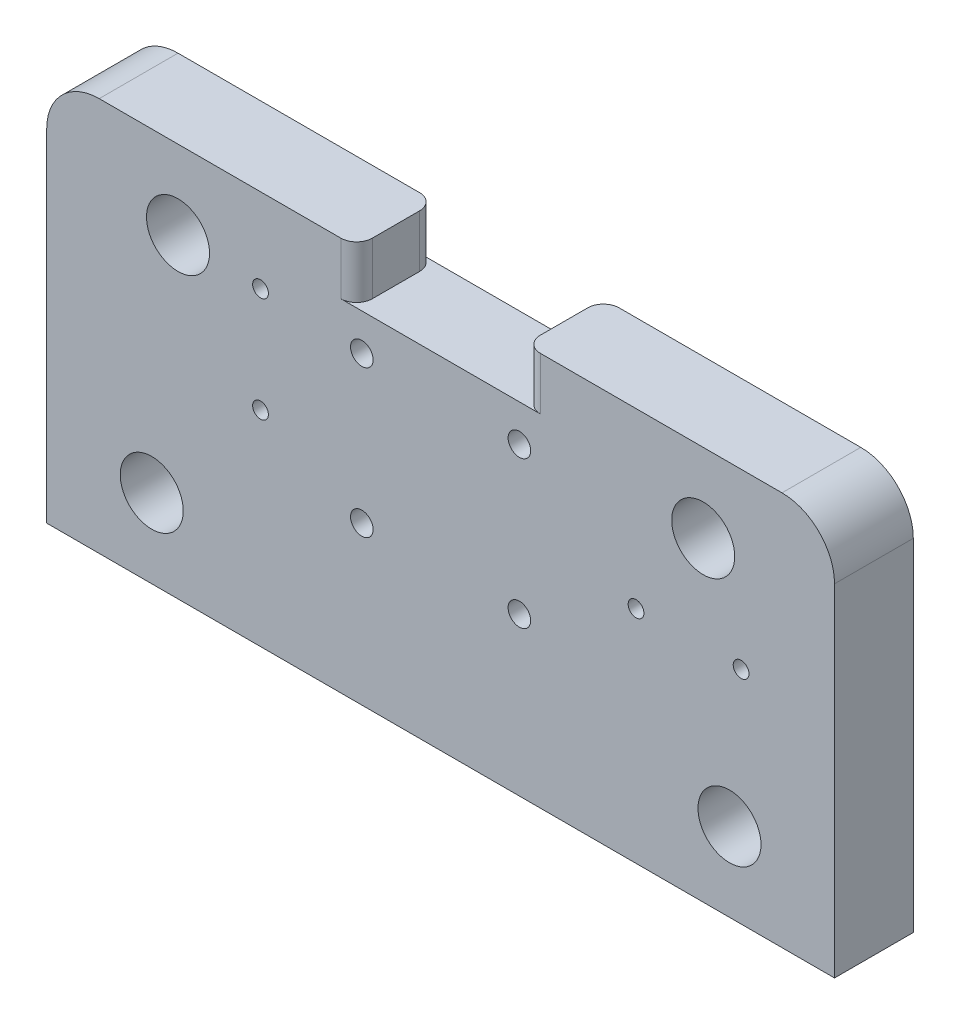
ISO-10303-21;
HEADER;
FILE_DESCRIPTION(('STEP AP214'),'2;1');
FILE_NAME('part.step','',(''),(''),'','','');
FILE_SCHEMA(('AUTOMOTIVE_DESIGN { 1 0 10303 214 1 1 1 1 }'));
ENDSEC;
DATA;
#1=APPLICATION_CONTEXT('core data for automotive mechanical design processes');
#2=APPLICATION_PROTOCOL_DEFINITION('international standard','automotive_design',2000,#1);
#3=PRODUCT_CONTEXT('',#1,'mechanical');
#4=PRODUCT('Part','Part','',(#3));
#5=PRODUCT_RELATED_PRODUCT_CATEGORY('part','',(#4));
#6=PRODUCT_DEFINITION_FORMATION('','',#4);
#7=PRODUCT_DEFINITION_CONTEXT('part definition',#1,'design');
#8=PRODUCT_DEFINITION('design','',#6,#7);
#9=PRODUCT_DEFINITION_SHAPE('','',#8);
#10=(LENGTH_UNIT() NAMED_UNIT(*) SI_UNIT(.MILLI.,.METRE.));
#11=(NAMED_UNIT(*) PLANE_ANGLE_UNIT() SI_UNIT($,.RADIAN.));
#12=(NAMED_UNIT(*) SI_UNIT($,.STERADIAN.) SOLID_ANGLE_UNIT());
#13=UNCERTAINTY_MEASURE_WITH_UNIT(LENGTH_MEASURE(1.E-05),#10,'distance_accuracy_value','');
#14=(GEOMETRIC_REPRESENTATION_CONTEXT(3) GLOBAL_UNCERTAINTY_ASSIGNED_CONTEXT((#13)) GLOBAL_UNIT_ASSIGNED_CONTEXT((#10,
#11,#12)) REPRESENTATION_CONTEXT('',''));
#15=CARTESIAN_POINT('',(0.,0.,0.));
#16=DIRECTION('',(0.,0.,1.));
#17=DIRECTION('',(1.,0.,0.));
#18=AXIS2_PLACEMENT_3D('',#15,#16,#17);
#19=CARTESIAN_POINT('',(-65.,27.5,15.));
#20=DIRECTION('',(0.,0.,-1.));
#21=DIRECTION('',(-1.,0.,0.));
#22=AXIS2_PLACEMENT_3D('',#19,#20,#21);
#23=PLANE('',#22);
#24=CARTESIAN_POINT('',(57.21,4.5,15.));
#25=DIRECTION('',(0.,0.,1.));
#26=DIRECTION('',(1.,0.,0.));
#27=AXIS2_PLACEMENT_3D('',#24,#25,#26);
#28=CIRCLE('',#27,1.5);
#29=CARTESIAN_POINT('',(58.71,4.5,15.));
#30=VERTEX_POINT('',#29);
#31=EDGE_CURVE('E745',#30,#30,#28,.T.);
#32=ORIENTED_EDGE('',*,*,#31,.F.);
#33=EDGE_LOOP('',(#32));
#34=FACE_BOUND('',#33,.T.);
#35=CARTESIAN_POINT('',(37.21,4.5,15.));
#36=DIRECTION('',(0.,0.,1.));
#37=DIRECTION('',(1.,0.,0.));
#38=AXIS2_PLACEMENT_3D('',#35,#36,#37);
#39=CIRCLE('',#38,1.5);
#40=CARTESIAN_POINT('',(38.71,4.5,15.));
#41=VERTEX_POINT('',#40);
#42=EDGE_CURVE('E741',#41,#41,#39,.T.);
#43=ORIENTED_EDGE('',*,*,#42,.F.);
#44=EDGE_LOOP('',(#43));
#45=FACE_BOUND('',#44,.T.);
#46=CARTESIAN_POINT('',(-34.29,1.50000000000002,15.));
#47=DIRECTION('',(0.,0.,1.));
#48=DIRECTION('',(1.,0.,0.));
#49=AXIS2_PLACEMENT_3D('',#46,#47,#48);
#50=CIRCLE('',#49,1.5);
#51=CARTESIAN_POINT('',(-32.79,1.50000000000002,15.));
#52=VERTEX_POINT('',#51);
#53=EDGE_CURVE('E730',#52,#52,#50,.T.);
#54=ORIENTED_EDGE('',*,*,#53,.F.);
#55=EDGE_LOOP('',(#54));
#56=FACE_BOUND('',#55,.T.);
#57=CARTESIAN_POINT('',(-34.29,21.5,15.));
#58=DIRECTION('',(0.,0.,1.));
#59=DIRECTION('',(1.,0.,0.));
#60=AXIS2_PLACEMENT_3D('',#57,#58,#59);
#61=CIRCLE('',#60,1.5);
#62=CARTESIAN_POINT('',(-32.79,21.5,15.));
#63=VERTEX_POINT('',#62);
#64=EDGE_CURVE('E721',#63,#63,#61,.T.);
#65=ORIENTED_EDGE('',*,*,#64,.F.);
#66=EDGE_LOOP('',(#65));
#67=FACE_BOUND('',#66,.T.);
#68=CARTESIAN_POINT('',(50.,22.5,15.));
#69=DIRECTION('',(0.,0.,1.));
#70=DIRECTION('',(1.,0.,0.));
#71=AXIS2_PLACEMENT_3D('',#68,#69,#70);
#72=CIRCLE('',#71,6.);
#73=CARTESIAN_POINT('',(56.,22.5,15.));
#74=VERTEX_POINT('',#73);
#75=EDGE_CURVE('E706',#74,#74,#72,.T.);
#76=ORIENTED_EDGE('',*,*,#75,.F.);
#77=EDGE_LOOP('',(#76));
#78=FACE_BOUND('',#77,.T.);
#79=CARTESIAN_POINT('',(-55.,-22.5,15.));
#80=DIRECTION('',(0.,0.,1.));
#81=DIRECTION('',(1.,0.,0.));
#82=AXIS2_PLACEMENT_3D('',#79,#80,#81);
#83=CIRCLE('',#82,5.99999999999999);
#84=CARTESIAN_POINT('',(-49.,-22.5,15.));
#85=VERTEX_POINT('',#84);
#86=EDGE_CURVE('E697',#85,#85,#83,.T.);
#87=ORIENTED_EDGE('',*,*,#86,.F.);
#88=EDGE_LOOP('',(#87));
#89=FACE_BOUND('',#88,.T.);
#90=CARTESIAN_POINT('',(55.,-22.5,15.));
#91=DIRECTION('',(0.,0.,1.));
#92=DIRECTION('',(1.,0.,0.));
#93=AXIS2_PLACEMENT_3D('',#90,#91,#92);
#94=CIRCLE('',#93,5.99999999999999);
#95=CARTESIAN_POINT('',(61.,-22.5,15.));
#96=VERTEX_POINT('',#95);
#97=EDGE_CURVE('E713',#96,#96,#94,.T.);
#98=ORIENTED_EDGE('',*,*,#97,.F.);
#99=EDGE_LOOP('',(#98));
#100=FACE_BOUND('',#99,.T.);
#101=CARTESIAN_POINT('',(-50.,22.5,15.));
#102=DIRECTION('',(0.,0.,1.));
#103=DIRECTION('',(1.,0.,0.));
#104=AXIS2_PLACEMENT_3D('',#101,#102,#103);
#105=CIRCLE('',#104,6.);
#106=CARTESIAN_POINT('',(-44.,22.5,15.));
#107=VERTEX_POINT('',#106);
#108=EDGE_CURVE('E689',#107,#107,#105,.T.);
#109=ORIENTED_EDGE('',*,*,#108,.F.);
#110=EDGE_LOOP('',(#109));
#111=FACE_BOUND('',#110,.T.);
#112=DIRECTION('',(1.,0.,0.));
#113=VECTOR('',#112,1.);
#114=CARTESIAN_POINT('',(16.,37.5,15.));
#115=LINE('',#114,#113);
#116=CARTESIAN_POINT('',(18.9999999999999,37.5,15.));
#117=VERTEX_POINT('',#116);
#118=CARTESIAN_POINT('',(65.,37.5,15.));
#119=VERTEX_POINT('',#118);
#120=EDGE_CURVE('E312',#117,#119,#115,.T.);
#121=ORIENTED_EDGE('',*,*,#120,.F.);
#122=DIRECTION('',(0.,-1.,0.));
#123=VECTOR('',#122,1.);
#124=CARTESIAN_POINT('',(18.9999999999999,27.5,15.));
#125=LINE('',#124,#123);
#126=CARTESIAN_POINT('',(18.9999999999999,27.5,15.));
#127=VERTEX_POINT('',#126);
#128=EDGE_CURVE('E402',#117,#127,#125,.T.);
#129=ORIENTED_EDGE('',*,*,#128,.T.);
#130=DIRECTION('',(1.,0.,0.));
#131=VECTOR('',#130,1.);
#132=CARTESIAN_POINT('',(-16.,27.5,15.));
#133=LINE('',#132,#131);
#134=CARTESIAN_POINT('',(-19.,27.5,15.));
#135=VERTEX_POINT('',#134);
#136=EDGE_CURVE('E295',#135,#127,#133,.T.);
#137=ORIENTED_EDGE('',*,*,#136,.F.);
#138=DIRECTION('',(0.,-1.,0.));
#139=VECTOR('',#138,1.);
#140=CARTESIAN_POINT('',(-19.,37.5,15.));
#141=LINE('',#140,#139);
#142=CARTESIAN_POINT('',(-19.,37.5,15.));
#143=VERTEX_POINT('',#142);
#144=EDGE_CURVE('E293',#135,#143,#141,.F.);
#145=ORIENTED_EDGE('',*,*,#144,.T.);
#146=DIRECTION('',(1.,0.,0.));
#147=VECTOR('',#146,1.);
#148=CARTESIAN_POINT('',(-65.,37.5,15.));
#149=LINE('',#148,#147);
#150=CARTESIAN_POINT('',(-65.,37.5,15.));
#151=VERTEX_POINT('',#150);
#152=EDGE_CURVE('E276',#151,#143,#149,.T.);
#153=ORIENTED_EDGE('',*,*,#152,.F.);
#154=CARTESIAN_POINT('',(-65.,27.5,15.));
#155=DIRECTION('',(0.,0.,-1.));
#156=DIRECTION('',(-1.,0.,0.));
#157=AXIS2_PLACEMENT_3D('',#154,#155,#156);
#158=CIRCLE('',#157,10.);
#159=CARTESIAN_POINT('',(-75.,27.5,15.));
#160=VERTEX_POINT('',#159);
#161=EDGE_CURVE('E292',#160,#151,#158,.T.);
#162=ORIENTED_EDGE('',*,*,#161,.F.);
#163=DIRECTION('',(0.,-1.,0.));
#164=VECTOR('',#163,1.);
#165=CARTESIAN_POINT('',(-75.,27.5,15.));
#166=LINE('',#165,#164);
#167=CARTESIAN_POINT('',(-75.,-37.5,15.));
#168=VERTEX_POINT('',#167);
#169=EDGE_CURVE('E286',#160,#168,#166,.T.);
#170=ORIENTED_EDGE('',*,*,#169,.T.);
#171=DIRECTION('',(1.,0.,0.));
#172=VECTOR('',#171,1.);
#173=CARTESIAN_POINT('',(-75.,-37.5,15.));
#174=LINE('',#173,#172);
#175=CARTESIAN_POINT('',(75.,-37.5,15.));
#176=VERTEX_POINT('',#175);
#177=EDGE_CURVE('E323',#168,#176,#174,.T.);
#178=ORIENTED_EDGE('',*,*,#177,.T.);
#179=DIRECTION('',(0.,-1.,0.));
#180=VECTOR('',#179,1.);
#181=CARTESIAN_POINT('',(75.,27.5,15.));
#182=LINE('',#181,#180);
#183=CARTESIAN_POINT('',(75.,27.5,15.));
#184=VERTEX_POINT('',#183);
#185=EDGE_CURVE('E319',#184,#176,#182,.T.);
#186=ORIENTED_EDGE('',*,*,#185,.F.);
#187=CARTESIAN_POINT('',(65.,27.5,15.));
#188=DIRECTION('',(0.,0.,1.));
#189=DIRECTION('',(1.,0.,0.));
#190=AXIS2_PLACEMENT_3D('',#187,#188,#189);
#191=CIRCLE('',#190,10.);
#192=EDGE_CURVE('E315',#184,#119,#191,.T.);
#193=ORIENTED_EDGE('',*,*,#192,.T.);
#194=EDGE_LOOP('',(#121,#129,#137,#145,#153,#162,#170,#178,#186,#193));
#195=FACE_BOUND('',#194,.T.);
#196=CARTESIAN_POINT('',(-15.,20.5,15.));
#197=DIRECTION('',(0.,0.,1.));
#198=DIRECTION('',(1.,0.,0.));
#199=AXIS2_PLACEMENT_3D('',#196,#197,#198);
#200=CIRCLE('',#199,2.15);
#201=CARTESIAN_POINT('',(-12.85,20.5,15.));
#202=VERTEX_POINT('',#201);
#203=EDGE_CURVE('E331',#202,#202,#200,.T.);
#204=ORIENTED_EDGE('',*,*,#203,.F.);
#205=EDGE_LOOP('',(#204));
#206=FACE_BOUND('',#205,.T.);
#207=CARTESIAN_POINT('',(15.,20.5,15.));
#208=DIRECTION('',(0.,0.,1.));
#209=DIRECTION('',(1.,0.,0.));
#210=AXIS2_PLACEMENT_3D('',#207,#208,#209);
#211=CIRCLE('',#210,2.15);
#212=CARTESIAN_POINT('',(17.15,20.5,15.));
#213=VERTEX_POINT('',#212);
#214=EDGE_CURVE('E650',#213,#213,#211,.T.);
#215=ORIENTED_EDGE('',*,*,#214,.F.);
#216=EDGE_LOOP('',(#215));
#217=FACE_BOUND('',#216,.T.);
#218=CARTESIAN_POINT('',(15.,-7.5,15.));
#219=DIRECTION('',(0.,0.,1.));
#220=DIRECTION('',(1.,0.,0.));
#221=AXIS2_PLACEMENT_3D('',#218,#219,#220);
#222=CIRCLE('',#221,2.15);
#223=CARTESIAN_POINT('',(17.15,-7.5,15.));
#224=VERTEX_POINT('',#223);
#225=EDGE_CURVE('E655',#224,#224,#222,.T.);
#226=ORIENTED_EDGE('',*,*,#225,.F.);
#227=EDGE_LOOP('',(#226));
#228=FACE_BOUND('',#227,.T.);
#229=CARTESIAN_POINT('',(-15.,-7.5,15.));
#230=DIRECTION('',(0.,0.,1.));
#231=DIRECTION('',(1.,0.,0.));
#232=AXIS2_PLACEMENT_3D('',#229,#230,#231);
#233=CIRCLE('',#232,2.15);
#234=CARTESIAN_POINT('',(-12.85,-7.5,15.));
#235=VERTEX_POINT('',#234);
#236=EDGE_CURVE('E678',#235,#235,#233,.T.);
#237=ORIENTED_EDGE('',*,*,#236,.F.);
#238=EDGE_LOOP('',(#237));
#239=FACE_BOUND('',#238,.T.);
#240=ADVANCED_FACE('F170',(#34,#45,#56,#67,#78,#89,#100,#111,#195,#206,#217,#228,#239),#23,.F.);
#241=CARTESIAN_POINT('',(-65.,27.5,0.));
#242=DIRECTION('',(0.,0.,-1.));
#243=DIRECTION('',(-1.,0.,0.));
#244=AXIS2_PLACEMENT_3D('',#241,#242,#243);
#245=PLANE('',#244);
#246=CARTESIAN_POINT('',(57.21,4.5,0.));
#247=DIRECTION('',(0.,0.,1.));
#248=DIRECTION('',(1.,0.,0.));
#249=AXIS2_PLACEMENT_3D('',#246,#247,#248);
#250=CIRCLE('',#249,1.5);
#251=CARTESIAN_POINT('',(58.71,4.5,0.));
#252=VERTEX_POINT('',#251);
#253=EDGE_CURVE('E726',#252,#252,#250,.T.);
#254=ORIENTED_EDGE('',*,*,#253,.T.);
#255=EDGE_LOOP('',(#254));
#256=FACE_BOUND('',#255,.T.);
#257=CARTESIAN_POINT('',(37.21,4.5,0.));
#258=DIRECTION('',(0.,0.,1.));
#259=DIRECTION('',(1.,0.,0.));
#260=AXIS2_PLACEMENT_3D('',#257,#258,#259);
#261=CIRCLE('',#260,1.5);
#262=CARTESIAN_POINT('',(38.71,4.5,0.));
#263=VERTEX_POINT('',#262);
#264=EDGE_CURVE('E737',#263,#263,#261,.T.);
#265=ORIENTED_EDGE('',*,*,#264,.T.);
#266=EDGE_LOOP('',(#265));
#267=FACE_BOUND('',#266,.T.);
#268=CARTESIAN_POINT('',(-34.29,1.50000000000002,0.));
#269=DIRECTION('',(0.,0.,1.));
#270=DIRECTION('',(1.,0.,0.));
#271=AXIS2_PLACEMENT_3D('',#268,#269,#270);
#272=CIRCLE('',#271,1.5);
#273=CARTESIAN_POINT('',(-32.79,1.50000000000002,0.));
#274=VERTEX_POINT('',#273);
#275=EDGE_CURVE('E717',#274,#274,#272,.T.);
#276=ORIENTED_EDGE('',*,*,#275,.T.);
#277=EDGE_LOOP('',(#276));
#278=FACE_BOUND('',#277,.T.);
#279=CARTESIAN_POINT('',(-34.29,21.5,0.));
#280=DIRECTION('',(0.,0.,1.));
#281=DIRECTION('',(1.,0.,0.));
#282=AXIS2_PLACEMENT_3D('',#279,#280,#281);
#283=CIRCLE('',#282,1.5);
#284=CARTESIAN_POINT('',(-32.79,21.5,0.));
#285=VERTEX_POINT('',#284);
#286=EDGE_CURVE('E725',#285,#285,#283,.T.);
#287=ORIENTED_EDGE('',*,*,#286,.T.);
#288=EDGE_LOOP('',(#287));
#289=FACE_BOUND('',#288,.T.);
#290=CARTESIAN_POINT('',(50.,22.5,0.));
#291=DIRECTION('',(0.,0.,1.));
#292=DIRECTION('',(1.,0.,0.));
#293=AXIS2_PLACEMENT_3D('',#290,#291,#292);
#294=CIRCLE('',#293,6.);
#295=CARTESIAN_POINT('',(56.,22.5,0.));
#296=VERTEX_POINT('',#295);
#297=EDGE_CURVE('E693',#296,#296,#294,.T.);
#298=ORIENTED_EDGE('',*,*,#297,.T.);
#299=EDGE_LOOP('',(#298));
#300=FACE_BOUND('',#299,.T.);
#301=CARTESIAN_POINT('',(-55.,-22.5,0.));
#302=DIRECTION('',(0.,0.,1.));
#303=DIRECTION('',(1.,0.,0.));
#304=AXIS2_PLACEMENT_3D('',#301,#302,#303);
#305=CIRCLE('',#304,5.99999999999999);
#306=CARTESIAN_POINT('',(-49.,-22.5,0.));
#307=VERTEX_POINT('',#306);
#308=EDGE_CURVE('E701',#307,#307,#305,.T.);
#309=ORIENTED_EDGE('',*,*,#308,.T.);
#310=EDGE_LOOP('',(#309));
#311=FACE_BOUND('',#310,.T.);
#312=CARTESIAN_POINT('',(55.,-22.5,0.));
#313=DIRECTION('',(0.,0.,1.));
#314=DIRECTION('',(1.,0.,0.));
#315=AXIS2_PLACEMENT_3D('',#312,#313,#314);
#316=CIRCLE('',#315,5.99999999999999);
#317=CARTESIAN_POINT('',(61.,-22.5,0.));
#318=VERTEX_POINT('',#317);
#319=EDGE_CURVE('E702',#318,#318,#316,.T.);
#320=ORIENTED_EDGE('',*,*,#319,.T.);
#321=EDGE_LOOP('',(#320));
#322=FACE_BOUND('',#321,.T.);
#323=CARTESIAN_POINT('',(-50.,22.5,0.));
#324=DIRECTION('',(0.,0.,1.));
#325=DIRECTION('',(1.,0.,0.));
#326=AXIS2_PLACEMENT_3D('',#323,#324,#325);
#327=CIRCLE('',#326,6.);
#328=CARTESIAN_POINT('',(-44.,22.5,0.));
#329=VERTEX_POINT('',#328);
#330=EDGE_CURVE('E686',#329,#329,#327,.T.);
#331=ORIENTED_EDGE('',*,*,#330,.T.);
#332=EDGE_LOOP('',(#331));
#333=FACE_BOUND('',#332,.T.);
#334=CARTESIAN_POINT('',(15.,-7.5,0.));
#335=DIRECTION('',(0.,0.,1.));
#336=DIRECTION('',(1.,0.,0.));
#337=AXIS2_PLACEMENT_3D('',#334,#335,#336);
#338=CIRCLE('',#337,2.15);
#339=CARTESIAN_POINT('',(17.15,-7.5,0.));
#340=VERTEX_POINT('',#339);
#341=EDGE_CURVE('E661',#340,#340,#338,.T.);
#342=ORIENTED_EDGE('',*,*,#341,.T.);
#343=EDGE_LOOP('',(#342));
#344=FACE_BOUND('',#343,.T.);
#345=CARTESIAN_POINT('',(-15.,20.5,0.));
#346=DIRECTION('',(0.,0.,1.));
#347=DIRECTION('',(1.,0.,0.));
#348=AXIS2_PLACEMENT_3D('',#345,#346,#347);
#349=CIRCLE('',#348,2.15);
#350=CARTESIAN_POINT('',(-12.85,20.5,0.));
#351=VERTEX_POINT('',#350);
#352=EDGE_CURVE('E307',#351,#351,#349,.T.);
#353=ORIENTED_EDGE('',*,*,#352,.T.);
#354=EDGE_LOOP('',(#353));
#355=FACE_BOUND('',#354,.T.);
#356=DIRECTION('',(1.,0.,0.));
#357=VECTOR('',#356,1.);
#358=CARTESIAN_POINT('',(-16.,27.5,0.));
#359=LINE('',#358,#357);
#360=CARTESIAN_POINT('',(-19.,27.5,0.));
#361=VERTEX_POINT('',#360);
#362=CARTESIAN_POINT('',(19.,27.5,0.));
#363=VERTEX_POINT('',#362);
#364=EDGE_CURVE('E334',#361,#363,#359,.T.);
#365=ORIENTED_EDGE('',*,*,#364,.T.);
#366=DIRECTION('',(0.,-1.,0.));
#367=VECTOR('',#366,1.);
#368=CARTESIAN_POINT('',(19.,37.5,0.));
#369=LINE('',#368,#367);
#370=CARTESIAN_POINT('',(19.,37.5,0.));
#371=VERTEX_POINT('',#370);
#372=EDGE_CURVE('E391',#363,#371,#369,.F.);
#373=ORIENTED_EDGE('',*,*,#372,.T.);
#374=DIRECTION('',(1.,0.,0.));
#375=VECTOR('',#374,1.);
#376=CARTESIAN_POINT('',(16.,37.5,0.));
#377=LINE('',#376,#375);
#378=CARTESIAN_POINT('',(65.,37.5,0.));
#379=VERTEX_POINT('',#378);
#380=EDGE_CURVE('E337',#371,#379,#377,.T.);
#381=ORIENTED_EDGE('',*,*,#380,.T.);
#382=CARTESIAN_POINT('',(65.,27.5,0.));
#383=DIRECTION('',(0.,0.,1.));
#384=DIRECTION('',(1.,0.,0.));
#385=AXIS2_PLACEMENT_3D('',#382,#383,#384);
#386=CIRCLE('',#385,10.);
#387=CARTESIAN_POINT('',(75.,27.5,0.));
#388=VERTEX_POINT('',#387);
#389=EDGE_CURVE('E340',#388,#379,#386,.T.);
#390=ORIENTED_EDGE('',*,*,#389,.F.);
#391=DIRECTION('',(0.,-1.,0.));
#392=VECTOR('',#391,1.);
#393=CARTESIAN_POINT('',(75.,27.5,0.));
#394=LINE('',#393,#392);
#395=CARTESIAN_POINT('',(75.,-37.5,0.));
#396=VERTEX_POINT('',#395);
#397=EDGE_CURVE('E344',#388,#396,#394,.T.);
#398=ORIENTED_EDGE('',*,*,#397,.T.);
#399=DIRECTION('',(1.,0.,0.));
#400=VECTOR('',#399,1.);
#401=CARTESIAN_POINT('',(-75.,-37.5,0.));
#402=LINE('',#401,#400);
#403=CARTESIAN_POINT('',(-75.,-37.5,0.));
#404=VERTEX_POINT('',#403);
#405=EDGE_CURVE('E304',#404,#396,#402,.T.);
#406=ORIENTED_EDGE('',*,*,#405,.F.);
#407=DIRECTION('',(0.,-1.,0.));
#408=VECTOR('',#407,1.);
#409=CARTESIAN_POINT('',(-75.,27.5,0.));
#410=LINE('',#409,#408);
#411=CARTESIAN_POINT('',(-75.,27.5,0.));
#412=VERTEX_POINT('',#411);
#413=EDGE_CURVE('E301',#412,#404,#410,.T.);
#414=ORIENTED_EDGE('',*,*,#413,.F.);
#415=CARTESIAN_POINT('',(-65.,27.5,0.));
#416=DIRECTION('',(0.,0.,-1.));
#417=DIRECTION('',(-1.,0.,0.));
#418=AXIS2_PLACEMENT_3D('',#415,#416,#417);
#419=CIRCLE('',#418,10.);
#420=CARTESIAN_POINT('',(-65.,37.5,0.));
#421=VERTEX_POINT('',#420);
#422=EDGE_CURVE('E328',#412,#421,#419,.T.);
#423=ORIENTED_EDGE('',*,*,#422,.T.);
#424=DIRECTION('',(1.,0.,0.));
#425=VECTOR('',#424,1.);
#426=CARTESIAN_POINT('',(-65.,37.5,0.));
#427=LINE('',#426,#425);
#428=CARTESIAN_POINT('',(-19.,37.5,0.));
#429=VERTEX_POINT('',#428);
#430=EDGE_CURVE('E279',#421,#429,#427,.T.);
#431=ORIENTED_EDGE('',*,*,#430,.T.);
#432=DIRECTION('',(0.,-1.,0.));
#433=VECTOR('',#432,1.);
#434=CARTESIAN_POINT('',(-19.,27.5,0.));
#435=LINE('',#434,#433);
#436=EDGE_CURVE('E387',#429,#361,#435,.T.);
#437=ORIENTED_EDGE('',*,*,#436,.T.);
#438=EDGE_LOOP('',(#365,#373,#381,#390,#398,#406,#414,#423,#431,#437));
#439=FACE_BOUND('',#438,.T.);
#440=CARTESIAN_POINT('',(15.,20.5,0.));
#441=DIRECTION('',(0.,0.,1.));
#442=DIRECTION('',(1.,0.,0.));
#443=AXIS2_PLACEMENT_3D('',#440,#441,#442);
#444=CIRCLE('',#443,2.15);
#445=CARTESIAN_POINT('',(17.15,20.5,0.));
#446=VERTEX_POINT('',#445);
#447=EDGE_CURVE('E653',#446,#446,#444,.T.);
#448=ORIENTED_EDGE('',*,*,#447,.T.);
#449=EDGE_LOOP('',(#448));
#450=FACE_BOUND('',#449,.T.);
#451=CARTESIAN_POINT('',(-15.,-7.5,0.));
#452=DIRECTION('',(0.,0.,1.));
#453=DIRECTION('',(1.,0.,0.));
#454=AXIS2_PLACEMENT_3D('',#451,#452,#453);
#455=CIRCLE('',#454,2.15);
#456=CARTESIAN_POINT('',(-12.85,-7.5,0.));
#457=VERTEX_POINT('',#456);
#458=EDGE_CURVE('E680',#457,#457,#455,.T.);
#459=ORIENTED_EDGE('',*,*,#458,.T.);
#460=EDGE_LOOP('',(#459));
#461=FACE_BOUND('',#460,.T.);
#462=ADVANCED_FACE('F456',(#256,#267,#278,#289,#300,#311,#322,#333,#344,#355,#439,#450,#461),
#245,.T.);
#463=CARTESIAN_POINT('',(-65.,27.5,15.));
#464=DIRECTION('',(0.,0.,-1.));
#465=DIRECTION('',(-1.,0.,0.));
#466=AXIS2_PLACEMENT_3D('',#463,#464,#465);
#467=CYLINDRICAL_SURFACE('',#466,10.);
#468=ORIENTED_EDGE('',*,*,#422,.F.);
#469=DIRECTION('',(0.,0.,-1.));
#470=VECTOR('',#469,1.);
#471=CARTESIAN_POINT('',(-75.,27.5,15.));
#472=LINE('',#471,#470);
#473=EDGE_CURVE('E298',#160,#412,#472,.T.);
#474=ORIENTED_EDGE('',*,*,#473,.F.);
#475=ORIENTED_EDGE('',*,*,#161,.T.);
#476=DIRECTION('',(0.,0.,-1.));
#477=VECTOR('',#476,1.);
#478=CARTESIAN_POINT('',(-65.,37.5,15.));
#479=LINE('',#478,#477);
#480=EDGE_CURVE('E272',#151,#421,#479,.T.);
#481=ORIENTED_EDGE('',*,*,#480,.T.);
#482=EDGE_LOOP('',(#468,#474,#475,#481));
#483=FACE_BOUND('',#482,.T.);
#484=ADVANCED_FACE('F297',(#483),#467,.T.);
#485=CARTESIAN_POINT('',(-75.,27.5,15.));
#486=DIRECTION('',(1.,0.,0.));
#487=DIRECTION('',(0.,1.,0.));
#488=AXIS2_PLACEMENT_3D('',#485,#486,#487);
#489=PLANE('',#488);
#490=ORIENTED_EDGE('',*,*,#413,.T.);
#491=DIRECTION('',(0.,0.,-1.));
#492=VECTOR('',#491,1.);
#493=CARTESIAN_POINT('',(-75.,-37.5,15.));
#494=LINE('',#493,#492);
#495=EDGE_CURVE('E354',#168,#404,#494,.T.);
#496=ORIENTED_EDGE('',*,*,#495,.F.);
#497=ORIENTED_EDGE('',*,*,#169,.F.);
#498=ORIENTED_EDGE('',*,*,#473,.T.);
#499=EDGE_LOOP('',(#490,#496,#497,#498));
#500=FACE_BOUND('',#499,.T.);
#501=ADVANCED_FACE('F462',(#500),#489,.F.);
#502=CARTESIAN_POINT('',(-75.,-37.5,15.));
#503=DIRECTION('',(0.,1.,0.));
#504=DIRECTION('',(0.,0.,1.));
#505=AXIS2_PLACEMENT_3D('',#502,#503,#504);
#506=PLANE('',#505);
#507=ORIENTED_EDGE('',*,*,#405,.T.);
#508=DIRECTION('',(0.,0.,-1.));
#509=VECTOR('',#508,1.);
#510=CARTESIAN_POINT('',(75.,-37.5,15.));
#511=LINE('',#510,#509);
#512=EDGE_CURVE('E358',#176,#396,#511,.T.);
#513=ORIENTED_EDGE('',*,*,#512,.F.);
#514=ORIENTED_EDGE('',*,*,#177,.F.);
#515=ORIENTED_EDGE('',*,*,#495,.T.);
#516=EDGE_LOOP('',(#507,#513,#514,#515));
#517=FACE_BOUND('',#516,.T.);
#518=ADVANCED_FACE('F465',(#517),#506,.F.);
#519=CARTESIAN_POINT('',(75.,27.5,15.));
#520=DIRECTION('',(1.,0.,0.));
#521=DIRECTION('',(0.,1.,0.));
#522=AXIS2_PLACEMENT_3D('',#519,#520,#521);
#523=PLANE('',#522);
#524=ORIENTED_EDGE('',*,*,#397,.F.);
#525=DIRECTION('',(0.,0.,-1.));
#526=VECTOR('',#525,1.);
#527=CARTESIAN_POINT('',(75.,27.5,15.));
#528=LINE('',#527,#526);
#529=EDGE_CURVE('E361',#184,#388,#528,.T.);
#530=ORIENTED_EDGE('',*,*,#529,.F.);
#531=ORIENTED_EDGE('',*,*,#185,.T.);
#532=ORIENTED_EDGE('',*,*,#512,.T.);
#533=EDGE_LOOP('',(#524,#530,#531,#532));
#534=FACE_BOUND('',#533,.T.);
#535=ADVANCED_FACE('F469',(#534),#523,.T.);
#536=CARTESIAN_POINT('',(65.,27.5,15.));
#537=DIRECTION('',(0.,0.,-1.));
#538=DIRECTION('',(-1.,0.,0.));
#539=AXIS2_PLACEMENT_3D('',#536,#537,#538);
#540=CYLINDRICAL_SURFACE('',#539,10.);
#541=ORIENTED_EDGE('',*,*,#389,.T.);
#542=DIRECTION('',(0.,0.,-1.));
#543=VECTOR('',#542,1.);
#544=CARTESIAN_POINT('',(65.,37.5,15.));
#545=LINE('',#544,#543);
#546=EDGE_CURVE('E364',#119,#379,#545,.T.);
#547=ORIENTED_EDGE('',*,*,#546,.F.);
#548=ORIENTED_EDGE('',*,*,#192,.F.);
#549=ORIENTED_EDGE('',*,*,#529,.T.);
#550=EDGE_LOOP('',(#541,#547,#548,#549));
#551=FACE_BOUND('',#550,.T.);
#552=ADVANCED_FACE('F444',(#551),#540,.T.);
#553=CARTESIAN_POINT('',(16.,37.5,15.));
#554=DIRECTION('',(0.,1.,0.));
#555=DIRECTION('',(-1.,0.,0.));
#556=AXIS2_PLACEMENT_3D('',#553,#554,#555);
#557=PLANE('',#556);
#558=ORIENTED_EDGE('',*,*,#380,.F.);
#559=CARTESIAN_POINT('',(19.,37.5,3.));
#560=DIRECTION('',(0.,1.,0.));
#561=DIRECTION('',(-1.,0.,0.));
#562=AXIS2_PLACEMENT_3D('',#559,#560,#561);
#563=CIRCLE('',#562,3.);
#564=CARTESIAN_POINT('',(16.,37.5,3.));
#565=VERTEX_POINT('',#564);
#566=EDGE_CURVE('E397',#371,#565,#563,.T.);
#567=ORIENTED_EDGE('',*,*,#566,.T.);
#568=DIRECTION('',(0.,0.,-1.));
#569=VECTOR('',#568,1.);
#570=CARTESIAN_POINT('',(16.,37.5,15.));
#571=LINE('',#570,#569);
#572=CARTESIAN_POINT('',(16.,37.5,12.));
#573=VERTEX_POINT('',#572);
#574=EDGE_CURVE('E368',#573,#565,#571,.T.);
#575=ORIENTED_EDGE('',*,*,#574,.F.);
#576=CARTESIAN_POINT('',(18.9999999999999,37.5,12.));
#577=DIRECTION('',(0.,1.,0.));
#578=DIRECTION('',(-1.,0.,0.));
#579=AXIS2_PLACEMENT_3D('',#576,#577,#578);
#580=CIRCLE('',#579,3.);
#581=EDGE_CURVE('E394',#573,#117,#580,.T.);
#582=ORIENTED_EDGE('',*,*,#581,.T.);
#583=ORIENTED_EDGE('',*,*,#120,.T.);
#584=ORIENTED_EDGE('',*,*,#546,.T.);
#585=EDGE_LOOP('',(#558,#567,#575,#582,#583,#584));
#586=FACE_BOUND('',#585,.T.);
#587=ADVANCED_FACE('F439',(#586),#557,.T.);
#588=CARTESIAN_POINT('',(16.,37.5,15.));
#589=DIRECTION('',(1.,0.,0.));
#590=DIRECTION('',(0.,0.,-1.));
#591=AXIS2_PLACEMENT_3D('',#588,#589,#590);
#592=PLANE('',#591);
#593=ORIENTED_EDGE('',*,*,#574,.T.);
#594=DIRECTION('',(0.,-1.,0.));
#595=VECTOR('',#594,1.);
#596=CARTESIAN_POINT('',(16.,27.5,3.));
#597=LINE('',#596,#595);
#598=CARTESIAN_POINT('',(16.,27.5,3.));
#599=VERTEX_POINT('',#598);
#600=EDGE_CURVE('E383',#565,#599,#597,.T.);
#601=ORIENTED_EDGE('',*,*,#600,.T.);
#602=DIRECTION('',(0.,0.,-1.));
#603=VECTOR('',#602,1.);
#604=CARTESIAN_POINT('',(16.,27.5,15.));
#605=LINE('',#604,#603);
#606=CARTESIAN_POINT('',(16.,27.5,12.));
#607=VERTEX_POINT('',#606);
#608=EDGE_CURVE('E372',#607,#599,#605,.T.);
#609=ORIENTED_EDGE('',*,*,#608,.F.);
#610=DIRECTION('',(0.,-1.,0.));
#611=VECTOR('',#610,1.);
#612=CARTESIAN_POINT('',(16.,37.5,12.));
#613=LINE('',#612,#611);
#614=EDGE_CURVE('E353',#607,#573,#613,.F.);
#615=ORIENTED_EDGE('',*,*,#614,.T.);
#616=EDGE_LOOP('',(#593,#601,#609,#615));
#617=FACE_BOUND('',#616,.T.);
#618=ADVANCED_FACE('F432',(#617),#592,.F.);
#619=CARTESIAN_POINT('',(-16.,27.5,15.));
#620=DIRECTION('',(0.,1.,0.));
#621=DIRECTION('',(-1.,0.,0.));
#622=AXIS2_PLACEMENT_3D('',#619,#620,#621);
#623=PLANE('',#622);
#624=ORIENTED_EDGE('',*,*,#364,.F.);
#625=CARTESIAN_POINT('',(-19.,27.5,3.));
#626=DIRECTION('',(0.,1.,0.));
#627=DIRECTION('',(-1.,0.,0.));
#628=AXIS2_PLACEMENT_3D('',#625,#626,#627);
#629=CIRCLE('',#628,3.);
#630=CARTESIAN_POINT('',(-16.,27.5,3.));
#631=VERTEX_POINT('',#630);
#632=EDGE_CURVE('E179',#361,#631,#629,.F.);
#633=ORIENTED_EDGE('',*,*,#632,.T.);
#634=DIRECTION('',(0.,0.,-1.));
#635=VECTOR('',#634,1.);
#636=CARTESIAN_POINT('',(-16.,27.5,15.));
#637=LINE('',#636,#635);
#638=CARTESIAN_POINT('',(-16.,27.5,12.));
#639=VERTEX_POINT('',#638);
#640=EDGE_CURVE('E376',#639,#631,#637,.T.);
#641=ORIENTED_EDGE('',*,*,#640,.F.);
#642=CARTESIAN_POINT('',(-19.,27.5,12.));
#643=DIRECTION('',(0.,1.,0.));
#644=DIRECTION('',(-1.,0.,0.));
#645=AXIS2_PLACEMENT_3D('',#642,#643,#644);
#646=CIRCLE('',#645,3.);
#647=EDGE_CURVE('E12',#639,#135,#646,.F.);
#648=ORIENTED_EDGE('',*,*,#647,.T.);
#649=ORIENTED_EDGE('',*,*,#136,.T.);
#650=CARTESIAN_POINT('',(18.9999999999999,27.5,12.));
#651=DIRECTION('',(0.,1.,0.));
#652=DIRECTION('',(-1.,0.,0.));
#653=AXIS2_PLACEMENT_3D('',#650,#651,#652);
#654=CIRCLE('',#653,3.);
#655=EDGE_CURVE('E422',#127,#607,#654,.F.);
#656=ORIENTED_EDGE('',*,*,#655,.T.);
#657=ORIENTED_EDGE('',*,*,#608,.T.);
#658=CARTESIAN_POINT('',(19.,27.5,3.));
#659=DIRECTION('',(0.,1.,0.));
#660=DIRECTION('',(-1.,0.,0.));
#661=AXIS2_PLACEMENT_3D('',#658,#659,#660);
#662=CIRCLE('',#661,3.);
#663=EDGE_CURVE('E418',#599,#363,#662,.F.);
#664=ORIENTED_EDGE('',*,*,#663,.T.);
#665=EDGE_LOOP('',(#624,#633,#641,#648,#649,#656,#657,#664));
#666=FACE_BOUND('',#665,.T.);
#667=ADVANCED_FACE('F427',(#666),#623,.T.);
#668=CARTESIAN_POINT('',(-16.,37.5,15.));
#669=DIRECTION('',(1.,0.,0.));
#670=DIRECTION('',(0.,0.,-1.));
#671=AXIS2_PLACEMENT_3D('',#668,#669,#670);
#672=PLANE('',#671);
#673=ORIENTED_EDGE('',*,*,#640,.T.);
#674=DIRECTION('',(0.,-1.,0.));
#675=VECTOR('',#674,1.);
#676=CARTESIAN_POINT('',(-16.,37.5,3.));
#677=LINE('',#676,#675);
#678=CARTESIAN_POINT('',(-16.,37.5,3.));
#679=VERTEX_POINT('',#678);
#680=EDGE_CURVE('E409',#631,#679,#677,.F.);
#681=ORIENTED_EDGE('',*,*,#680,.T.);
#682=DIRECTION('',(0.,0.,-1.));
#683=VECTOR('',#682,1.);
#684=CARTESIAN_POINT('',(-16.,37.5,15.));
#685=LINE('',#684,#683);
#686=CARTESIAN_POINT('',(-16.,37.5,12.));
#687=VERTEX_POINT('',#686);
#688=EDGE_CURVE('E285',#687,#679,#685,.T.);
#689=ORIENTED_EDGE('',*,*,#688,.F.);
#690=DIRECTION('',(0.,-1.,0.));
#691=VECTOR('',#690,1.);
#692=CARTESIAN_POINT('',(-16.,27.5,12.));
#693=LINE('',#692,#691);
#694=EDGE_CURVE('E406',#687,#639,#693,.T.);
#695=ORIENTED_EDGE('',*,*,#694,.T.);
#696=EDGE_LOOP('',(#673,#681,#689,#695));
#697=FACE_BOUND('',#696,.T.);
#698=ADVANCED_FACE('F521',(#697),#672,.T.);
#699=CARTESIAN_POINT('',(-65.,37.5,15.));
#700=DIRECTION('',(0.,1.,0.));
#701=DIRECTION('',(-1.,0.,0.));
#702=AXIS2_PLACEMENT_3D('',#699,#700,#701);
#703=PLANE('',#702);
#704=ORIENTED_EDGE('',*,*,#688,.T.);
#705=CARTESIAN_POINT('',(-19.,37.5,3.));
#706=DIRECTION('',(0.,1.,0.));
#707=DIRECTION('',(-1.,0.,0.));
#708=AXIS2_PLACEMENT_3D('',#705,#706,#707);
#709=CIRCLE('',#708,3.);
#710=EDGE_CURVE('E415',#679,#429,#709,.T.);
#711=ORIENTED_EDGE('',*,*,#710,.T.);
#712=ORIENTED_EDGE('',*,*,#430,.F.);
#713=ORIENTED_EDGE('',*,*,#480,.F.);
#714=ORIENTED_EDGE('',*,*,#152,.T.);
#715=CARTESIAN_POINT('',(-19.,37.5,12.));
#716=DIRECTION('',(0.,1.,0.));
#717=DIRECTION('',(-1.,0.,0.));
#718=AXIS2_PLACEMENT_3D('',#715,#716,#717);
#719=CIRCLE('',#718,3.);
#720=EDGE_CURVE('E412',#143,#687,#719,.T.);
#721=ORIENTED_EDGE('',*,*,#720,.T.);
#722=EDGE_LOOP('',(#704,#711,#712,#713,#714,#721));
#723=FACE_BOUND('',#722,.T.);
#724=ADVANCED_FACE('F275',(#723),#703,.T.);
#725=CARTESIAN_POINT('',(-15.,20.5,15.));
#726=DIRECTION('',(0.,0.,-1.));
#727=DIRECTION('',(-1.,0.,0.));
#728=AXIS2_PLACEMENT_3D('',#725,#726,#727);
#729=CYLINDRICAL_SURFACE('',#728,2.15);
#730=ORIENTED_EDGE('',*,*,#203,.T.);
#731=EDGE_LOOP('',(#730));
#732=FACE_BOUND('',#731,.T.);
#733=ORIENTED_EDGE('',*,*,#352,.F.);
#734=EDGE_LOOP('',(#733));
#735=FACE_BOUND('',#734,.T.);
#736=ADVANCED_FACE('F490',(#732,#735),#729,.F.);
#737=CARTESIAN_POINT('',(15.,20.5,15.));
#738=DIRECTION('',(0.,0.,-1.));
#739=DIRECTION('',(-1.,0.,0.));
#740=AXIS2_PLACEMENT_3D('',#737,#738,#739);
#741=CYLINDRICAL_SURFACE('',#740,2.15);
#742=ORIENTED_EDGE('',*,*,#214,.T.);
#743=EDGE_LOOP('',(#742));
#744=FACE_BOUND('',#743,.T.);
#745=ORIENTED_EDGE('',*,*,#447,.F.);
#746=EDGE_LOOP('',(#745));
#747=FACE_BOUND('',#746,.T.);
#748=ADVANCED_FACE('F640',(#744,#747),#741,.F.);
#749=CARTESIAN_POINT('',(15.,-7.5,15.));
#750=DIRECTION('',(0.,0.,-1.));
#751=DIRECTION('',(-1.,0.,0.));
#752=AXIS2_PLACEMENT_3D('',#749,#750,#751);
#753=CYLINDRICAL_SURFACE('',#752,2.15);
#754=ORIENTED_EDGE('',*,*,#225,.T.);
#755=EDGE_LOOP('',(#754));
#756=FACE_BOUND('',#755,.T.);
#757=ORIENTED_EDGE('',*,*,#341,.F.);
#758=EDGE_LOOP('',(#757));
#759=FACE_BOUND('',#758,.T.);
#760=ADVANCED_FACE('F637',(#756,#759),#753,.F.);
#761=CARTESIAN_POINT('',(-15.,-7.5,15.));
#762=DIRECTION('',(0.,0.,-1.));
#763=DIRECTION('',(-1.,0.,0.));
#764=AXIS2_PLACEMENT_3D('',#761,#762,#763);
#765=CYLINDRICAL_SURFACE('',#764,2.15);
#766=ORIENTED_EDGE('',*,*,#236,.T.);
#767=EDGE_LOOP('',(#766));
#768=FACE_BOUND('',#767,.T.);
#769=ORIENTED_EDGE('',*,*,#458,.F.);
#770=EDGE_LOOP('',(#769));
#771=FACE_BOUND('',#770,.T.);
#772=ADVANCED_FACE('F633',(#768,#771),#765,.F.);
#773=CARTESIAN_POINT('',(-50.,22.5,0.));
#774=DIRECTION('',(0.,0.,1.));
#775=DIRECTION('',(1.,0.,0.));
#776=AXIS2_PLACEMENT_3D('',#773,#774,#775);
#777=CYLINDRICAL_SURFACE('',#776,6.);
#778=ORIENTED_EDGE('',*,*,#330,.F.);
#779=EDGE_LOOP('',(#778));
#780=FACE_BOUND('',#779,.T.);
#781=ORIENTED_EDGE('',*,*,#108,.T.);
#782=EDGE_LOOP('',(#781));
#783=FACE_BOUND('',#782,.T.);
#784=ADVANCED_FACE('F624',(#780,#783),#777,.F.);
#785=CARTESIAN_POINT('',(55.,-22.5,0.));
#786=DIRECTION('',(0.,0.,1.));
#787=DIRECTION('',(1.,0.,0.));
#788=AXIS2_PLACEMENT_3D('',#785,#786,#787);
#789=CYLINDRICAL_SURFACE('',#788,5.99999999999999);
#790=ORIENTED_EDGE('',*,*,#319,.F.);
#791=EDGE_LOOP('',(#790));
#792=FACE_BOUND('',#791,.T.);
#793=ORIENTED_EDGE('',*,*,#97,.T.);
#794=EDGE_LOOP('',(#793));
#795=FACE_BOUND('',#794,.T.);
#796=ADVANCED_FACE('F620',(#792,#795),#789,.F.);
#797=CARTESIAN_POINT('',(-55.,-22.5,0.));
#798=DIRECTION('',(0.,0.,1.));
#799=DIRECTION('',(1.,0.,0.));
#800=AXIS2_PLACEMENT_3D('',#797,#798,#799);
#801=CYLINDRICAL_SURFACE('',#800,5.99999999999999);
#802=ORIENTED_EDGE('',*,*,#308,.F.);
#803=EDGE_LOOP('',(#802));
#804=FACE_BOUND('',#803,.T.);
#805=ORIENTED_EDGE('',*,*,#86,.T.);
#806=EDGE_LOOP('',(#805));
#807=FACE_BOUND('',#806,.T.);
#808=ADVANCED_FACE('F623',(#804,#807),#801,.F.);
#809=CARTESIAN_POINT('',(50.,22.5,0.));
#810=DIRECTION('',(0.,0.,1.));
#811=DIRECTION('',(1.,0.,0.));
#812=AXIS2_PLACEMENT_3D('',#809,#810,#811);
#813=CYLINDRICAL_SURFACE('',#812,6.);
#814=ORIENTED_EDGE('',*,*,#297,.F.);
#815=EDGE_LOOP('',(#814));
#816=FACE_BOUND('',#815,.T.);
#817=ORIENTED_EDGE('',*,*,#75,.T.);
#818=EDGE_LOOP('',(#817));
#819=FACE_BOUND('',#818,.T.);
#820=ADVANCED_FACE('F506',(#816,#819),#813,.F.);
#821=CARTESIAN_POINT('',(19.,37.5,3.));
#822=DIRECTION('',(0.,1.,0.));
#823=DIRECTION('',(0.,0.,1.));
#824=AXIS2_PLACEMENT_3D('',#821,#822,#823);
#825=CYLINDRICAL_SURFACE('',#824,3.);
#826=ORIENTED_EDGE('',*,*,#566,.F.);
#827=ORIENTED_EDGE('',*,*,#372,.F.);
#828=ORIENTED_EDGE('',*,*,#663,.F.);
#829=ORIENTED_EDGE('',*,*,#600,.F.);
#830=EDGE_LOOP('',(#826,#827,#828,#829));
#831=FACE_BOUND('',#830,.T.);
#832=ADVANCED_FACE('F450',(#831),#825,.T.);
#833=CARTESIAN_POINT('',(18.9999999999999,27.5,12.));
#834=DIRECTION('',(0.,-1.,0.));
#835=DIRECTION('',(0.,0.,-1.));
#836=AXIS2_PLACEMENT_3D('',#833,#834,#835);
#837=CYLINDRICAL_SURFACE('',#836,3.);
#838=ORIENTED_EDGE('',*,*,#581,.F.);
#839=ORIENTED_EDGE('',*,*,#614,.F.);
#840=ORIENTED_EDGE('',*,*,#655,.F.);
#841=ORIENTED_EDGE('',*,*,#128,.F.);
#842=EDGE_LOOP('',(#838,#839,#840,#841));
#843=FACE_BOUND('',#842,.T.);
#844=ADVANCED_FACE('F436',(#843),#837,.T.);
#845=CARTESIAN_POINT('',(-19.,27.5,3.));
#846=DIRECTION('',(0.,-1.,0.));
#847=DIRECTION('',(0.,0.,-1.));
#848=AXIS2_PLACEMENT_3D('',#845,#846,#847);
#849=CYLINDRICAL_SURFACE('',#848,3.);
#850=ORIENTED_EDGE('',*,*,#710,.F.);
#851=ORIENTED_EDGE('',*,*,#680,.F.);
#852=ORIENTED_EDGE('',*,*,#632,.F.);
#853=ORIENTED_EDGE('',*,*,#436,.F.);
#854=EDGE_LOOP('',(#850,#851,#852,#853));
#855=FACE_BOUND('',#854,.T.);
#856=ADVANCED_FACE('F455',(#855),#849,.T.);
#857=CARTESIAN_POINT('',(-19.,37.5,12.));
#858=DIRECTION('',(0.,1.,0.));
#859=DIRECTION('',(0.,0.,1.));
#860=AXIS2_PLACEMENT_3D('',#857,#858,#859);
#861=CYLINDRICAL_SURFACE('',#860,3.);
#862=ORIENTED_EDGE('',*,*,#720,.F.);
#863=ORIENTED_EDGE('',*,*,#144,.F.);
#864=ORIENTED_EDGE('',*,*,#647,.F.);
#865=ORIENTED_EDGE('',*,*,#694,.F.);
#866=EDGE_LOOP('',(#862,#863,#864,#865));
#867=FACE_BOUND('',#866,.T.);
#868=ADVANCED_FACE('F172',(#867),#861,.T.);
#869=CARTESIAN_POINT('',(-34.29,21.5,0.));
#870=DIRECTION('',(0.,0.,1.));
#871=DIRECTION('',(1.,0.,0.));
#872=AXIS2_PLACEMENT_3D('',#869,#870,#871);
#873=CYLINDRICAL_SURFACE('',#872,1.5);
#874=ORIENTED_EDGE('',*,*,#286,.F.);
#875=EDGE_LOOP('',(#874));
#876=FACE_BOUND('',#875,.T.);
#877=ORIENTED_EDGE('',*,*,#64,.T.);
#878=EDGE_LOOP('',(#877));
#879=FACE_BOUND('',#878,.T.);
#880=ADVANCED_FACE('F512',(#876,#879),#873,.F.);
#881=CARTESIAN_POINT('',(-34.29,1.50000000000002,0.));
#882=DIRECTION('',(0.,0.,1.));
#883=DIRECTION('',(1.,0.,0.));
#884=AXIS2_PLACEMENT_3D('',#881,#882,#883);
#885=CYLINDRICAL_SURFACE('',#884,1.5);
#886=ORIENTED_EDGE('',*,*,#275,.F.);
#887=EDGE_LOOP('',(#886));
#888=FACE_BOUND('',#887,.T.);
#889=ORIENTED_EDGE('',*,*,#53,.T.);
#890=EDGE_LOOP('',(#889));
#891=FACE_BOUND('',#890,.T.);
#892=ADVANCED_FACE('F516',(#888,#891),#885,.F.);
#893=CARTESIAN_POINT('',(37.21,4.5,0.));
#894=DIRECTION('',(0.,0.,1.));
#895=DIRECTION('',(1.,0.,0.));
#896=AXIS2_PLACEMENT_3D('',#893,#894,#895);
#897=CYLINDRICAL_SURFACE('',#896,1.5);
#898=ORIENTED_EDGE('',*,*,#264,.F.);
#899=EDGE_LOOP('',(#898));
#900=FACE_BOUND('',#899,.T.);
#901=ORIENTED_EDGE('',*,*,#42,.T.);
#902=EDGE_LOOP('',(#901));
#903=FACE_BOUND('',#902,.T.);
#904=ADVANCED_FACE('F592',(#900,#903),#897,.F.);
#905=CARTESIAN_POINT('',(57.21,4.5,0.));
#906=DIRECTION('',(0.,0.,1.));
#907=DIRECTION('',(1.,0.,0.));
#908=AXIS2_PLACEMENT_3D('',#905,#906,#907);
#909=CYLINDRICAL_SURFACE('',#908,1.5);
#910=ORIENTED_EDGE('',*,*,#253,.F.);
#911=EDGE_LOOP('',(#910));
#912=FACE_BOUND('',#911,.T.);
#913=ORIENTED_EDGE('',*,*,#31,.T.);
#914=EDGE_LOOP('',(#913));
#915=FACE_BOUND('',#914,.T.);
#916=ADVANCED_FACE('F603',(#912,#915),#909,.F.);
#917=CLOSED_SHELL('',(#240,#462,#484,#501,#518,#535,#552,#587,#618,#667,#698,#724,#736,#748,
#760,#772,#784,#796,#808,#820,#832,#844,#856,#868,#880,#892,#904,#916));
#918=MANIFOLD_SOLID_BREP('B2',#917);
#919=ADVANCED_BREP_SHAPE_REPRESENTATION('',(#18,#918),#14);
#920=SHAPE_DEFINITION_REPRESENTATION(#9,#919);
ENDSEC;
END-ISO-10303-21;
